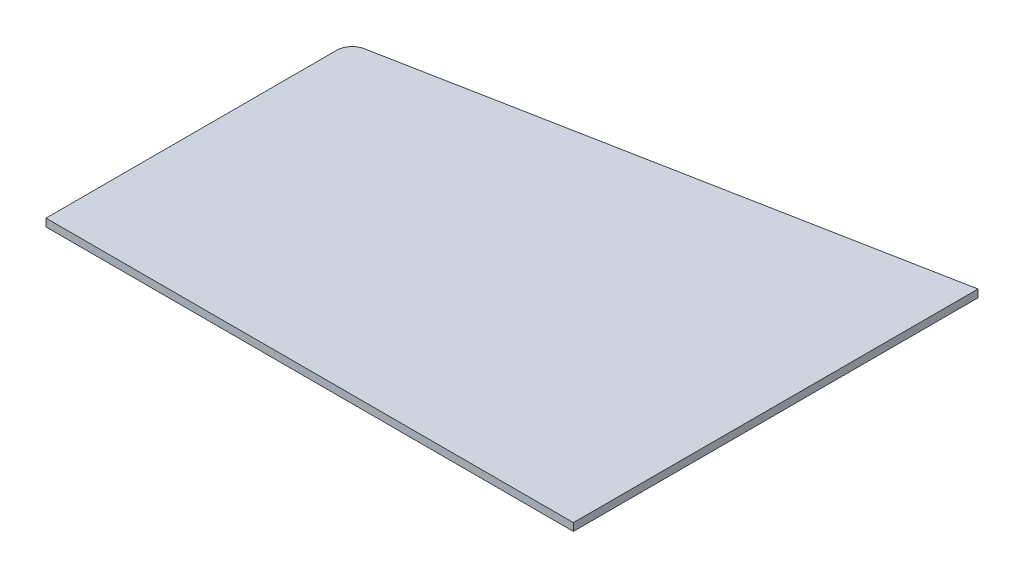
ISO-10303-21;
HEADER;
FILE_DESCRIPTION(('STEP AP214'),'2;1');
FILE_NAME('part.step','',(''),(''),'','','');
FILE_SCHEMA(('AUTOMOTIVE_DESIGN { 1 0 10303 214 1 1 1 1 }'));
ENDSEC;
DATA;
#1=APPLICATION_CONTEXT('core data for automotive mechanical design processes');
#2=APPLICATION_PROTOCOL_DEFINITION('international standard','automotive_design',2000,#1);
#3=PRODUCT_CONTEXT('',#1,'mechanical');
#4=PRODUCT('Part','Part','',(#3));
#5=PRODUCT_RELATED_PRODUCT_CATEGORY('part','',(#4));
#6=PRODUCT_DEFINITION_FORMATION('','',#4);
#7=PRODUCT_DEFINITION_CONTEXT('part definition',#1,'design');
#8=PRODUCT_DEFINITION('design','',#6,#7);
#9=PRODUCT_DEFINITION_SHAPE('','',#8);
#10=(LENGTH_UNIT() NAMED_UNIT(*) SI_UNIT(.MILLI.,.METRE.));
#11=(NAMED_UNIT(*) PLANE_ANGLE_UNIT() SI_UNIT($,.RADIAN.));
#12=(NAMED_UNIT(*) SI_UNIT($,.STERADIAN.) SOLID_ANGLE_UNIT());
#13=UNCERTAINTY_MEASURE_WITH_UNIT(LENGTH_MEASURE(1.E-05),#10,'distance_accuracy_value','');
#14=(GEOMETRIC_REPRESENTATION_CONTEXT(3) GLOBAL_UNCERTAINTY_ASSIGNED_CONTEXT((#13)) GLOBAL_UNIT_ASSIGNED_CONTEXT((#10,
#11,#12)) REPRESENTATION_CONTEXT('',''));
#15=CARTESIAN_POINT('',(0.,0.,0.));
#16=DIRECTION('',(0.,0.,1.));
#17=DIRECTION('',(1.,0.,0.));
#18=AXIS2_PLACEMENT_3D('',#15,#16,#17);
#19=CARTESIAN_POINT('',(0.,6.35,-240.964350343859));
#20=DIRECTION('',(1.,0.,0.));
#21=DIRECTION('',(0.,0.,-1.));
#22=AXIS2_PLACEMENT_3D('',#19,#20,#21);
#23=PLANE('',#22);
#24=DIRECTION('',(0.,0.,1.));
#25=VECTOR('',#24,1.);
#26=CARTESIAN_POINT('',(0.,0.,-240.964350343859));
#27=LINE('',#26,#25);
#28=CARTESIAN_POINT('',(0.,0.,-240.964350343859));
#29=VERTEX_POINT('',#28);
#30=CARTESIAN_POINT('',(0.,0.,0.));
#31=VERTEX_POINT('',#30);
#32=EDGE_CURVE('E118',#29,#31,#27,.T.);
#33=ORIENTED_EDGE('',*,*,#32,.T.);
#34=DIRECTION('',(0.,-1.,0.));
#35=VECTOR('',#34,1.);
#36=CARTESIAN_POINT('',(0.,6.35,0.));
#37=LINE('',#36,#35);
#38=CARTESIAN_POINT('',(0.,6.35,0.));
#39=VERTEX_POINT('',#38);
#40=EDGE_CURVE('E11',#39,#31,#37,.T.);
#41=ORIENTED_EDGE('',*,*,#40,.F.);
#42=DIRECTION('',(0.,0.,1.));
#43=VECTOR('',#42,1.);
#44=CARTESIAN_POINT('',(0.,6.35,-240.964350343859));
#45=LINE('',#44,#43);
#46=CARTESIAN_POINT('',(0.,6.35,-240.964350343859));
#47=VERTEX_POINT('',#46);
#48=EDGE_CURVE('E131',#47,#39,#45,.T.);
#49=ORIENTED_EDGE('',*,*,#48,.F.);
#50=DIRECTION('',(0.,-1.,0.));
#51=VECTOR('',#50,1.);
#52=CARTESIAN_POINT('',(0.,6.35,-240.964350343859));
#53=LINE('',#52,#51);
#54=EDGE_CURVE('E114',#47,#29,#53,.T.);
#55=ORIENTED_EDGE('',*,*,#54,.T.);
#56=EDGE_LOOP('',(#33,#41,#49,#55));
#57=FACE_BOUND('',#56,.T.);
#58=ADVANCED_FACE('F39',(#57),#23,.F.);
#59=CARTESIAN_POINT('',(0.,6.35,0.));
#60=DIRECTION('',(0.,0.,-1.));
#61=DIRECTION('',(-1.,0.,0.));
#62=AXIS2_PLACEMENT_3D('',#59,#60,#61);
#63=PLANE('',#62);
#64=DIRECTION('',(1.,0.,0.));
#65=VECTOR('',#64,1.);
#66=CARTESIAN_POINT('',(0.,0.,0.));
#67=LINE('',#66,#65);
#68=CARTESIAN_POINT('',(437.02224,0.,0.));
#69=VERTEX_POINT('',#68);
#70=EDGE_CURVE('E122',#31,#69,#67,.T.);
#71=ORIENTED_EDGE('',*,*,#70,.T.);
#72=DIRECTION('',(0.,-1.,0.));
#73=VECTOR('',#72,1.);
#74=CARTESIAN_POINT('',(437.02224,6.35,0.));
#75=LINE('',#74,#73);
#76=CARTESIAN_POINT('',(437.02224,6.35,0.));
#77=VERTEX_POINT('',#76);
#78=EDGE_CURVE('E48',#77,#69,#75,.T.);
#79=ORIENTED_EDGE('',*,*,#78,.F.);
#80=DIRECTION('',(1.,0.,0.));
#81=VECTOR('',#80,1.);
#82=CARTESIAN_POINT('',(0.,6.35,0.));
#83=LINE('',#82,#81);
#84=EDGE_CURVE('E90',#39,#77,#83,.T.);
#85=ORIENTED_EDGE('',*,*,#84,.F.);
#86=ORIENTED_EDGE('',*,*,#40,.T.);
#87=EDGE_LOOP('',(#71,#79,#85,#86));
#88=FACE_BOUND('',#87,.T.);
#89=ADVANCED_FACE('F153',(#88),#63,.F.);
#90=CARTESIAN_POINT('',(437.02224,6.35,0.));
#91=DIRECTION('',(-1.,0.,0.));
#92=DIRECTION('',(0.,0.,1.));
#93=AXIS2_PLACEMENT_3D('',#90,#91,#92);
#94=PLANE('',#93);
#95=DIRECTION('',(0.,0.,-1.));
#96=VECTOR('',#95,1.);
#97=CARTESIAN_POINT('',(437.02224,0.,0.));
#98=LINE('',#97,#96);
#99=CARTESIAN_POINT('',(437.02224,0.,-335.28));
#100=VERTEX_POINT('',#99);
#101=EDGE_CURVE('E106',#69,#100,#98,.T.);
#102=ORIENTED_EDGE('',*,*,#101,.T.);
#103=DIRECTION('',(0.,-1.,0.));
#104=VECTOR('',#103,1.);
#105=CARTESIAN_POINT('',(437.02224,6.35,-335.28));
#106=LINE('',#105,#104);
#107=CARTESIAN_POINT('',(437.02224,6.35,-335.28));
#108=VERTEX_POINT('',#107);
#109=EDGE_CURVE('E103',#108,#100,#106,.T.);
#110=ORIENTED_EDGE('',*,*,#109,.F.);
#111=DIRECTION('',(0.,0.,-1.));
#112=VECTOR('',#111,1.);
#113=CARTESIAN_POINT('',(437.02224,6.35,0.));
#114=LINE('',#113,#112);
#115=EDGE_CURVE('E94',#77,#108,#114,.T.);
#116=ORIENTED_EDGE('',*,*,#115,.F.);
#117=ORIENTED_EDGE('',*,*,#78,.T.);
#118=EDGE_LOOP('',(#102,#110,#116,#117));
#119=FACE_BOUND('',#118,.T.);
#120=ADVANCED_FACE('F104',(#119),#94,.F.);
#121=CARTESIAN_POINT('',(437.02224,6.35,-335.28));
#122=DIRECTION('',(0.188364672621634,0.,0.982099154926907));
#123=DIRECTION('',(0.982099154926907,0.,-0.188364672621634));
#124=AXIS2_PLACEMENT_3D('',#121,#122,#123);
#125=PLANE('',#124);
#126=DIRECTION('',(-0.982099154926907,0.,0.188364672621634));
#127=VECTOR('',#126,1.);
#128=CARTESIAN_POINT('',(437.02224,0.,-335.28));
#129=LINE('',#128,#127);
#130=CARTESIAN_POINT('',(10.3077686577053,0.,-253.43700961143));
#131=VERTEX_POINT('',#130);
#132=EDGE_CURVE('E76',#100,#131,#129,.T.);
#133=ORIENTED_EDGE('',*,*,#132,.T.);
#134=DIRECTION('',(0.,-1.,0.));
#135=VECTOR('',#134,1.);
#136=CARTESIAN_POINT('',(10.3077686577053,6.35,-253.43700961143));
#137=LINE('',#136,#135);
#138=CARTESIAN_POINT('',(10.3077686577053,6.35,-253.43700961143));
#139=VERTEX_POINT('',#138);
#140=EDGE_CURVE('E108',#139,#131,#137,.T.);
#141=ORIENTED_EDGE('',*,*,#140,.F.);
#142=DIRECTION('',(-0.982099154926907,0.,0.188364672621634));
#143=VECTOR('',#142,1.);
#144=CARTESIAN_POINT('',(437.02224,6.35,-335.28));
#145=LINE('',#144,#143);
#146=EDGE_CURVE('E98',#108,#139,#145,.T.);
#147=ORIENTED_EDGE('',*,*,#146,.F.);
#148=ORIENTED_EDGE('',*,*,#109,.T.);
#149=EDGE_LOOP('',(#133,#141,#147,#148));
#150=FACE_BOUND('',#149,.T.);
#151=ADVANCED_FACE('F110',(#150),#125,.F.);
#152=CARTESIAN_POINT('',(12.7,6.35,-240.964350343859));
#153=DIRECTION('',(0.,-1.,0.));
#154=DIRECTION('',(0.,0.,-1.));
#155=AXIS2_PLACEMENT_3D('',#152,#153,#154);
#156=CYLINDRICAL_SURFACE('',#155,12.7);
#157=CARTESIAN_POINT('',(12.7,0.,-240.964350343859));
#158=DIRECTION('',(0.,1.,0.));
#159=DIRECTION('',(0.,0.,1.));
#160=AXIS2_PLACEMENT_3D('',#157,#158,#159);
#161=CIRCLE('',#160,12.7);
#162=EDGE_CURVE('E82',#131,#29,#161,.T.);
#163=ORIENTED_EDGE('',*,*,#162,.T.);
#164=ORIENTED_EDGE('',*,*,#54,.F.);
#165=CARTESIAN_POINT('',(12.7,6.35,-240.964350343859));
#166=DIRECTION('',(0.,1.,0.));
#167=DIRECTION('',(0.,0.,1.));
#168=AXIS2_PLACEMENT_3D('',#165,#166,#167);
#169=CIRCLE('',#168,12.7);
#170=EDGE_CURVE('E56',#139,#47,#169,.T.);
#171=ORIENTED_EDGE('',*,*,#170,.F.);
#172=ORIENTED_EDGE('',*,*,#140,.T.);
#173=EDGE_LOOP('',(#163,#164,#171,#172));
#174=FACE_BOUND('',#173,.T.);
#175=ADVANCED_FACE('F142',(#174),#156,.T.);
#176=CARTESIAN_POINT('',(12.7,6.35,-240.964350343859));
#177=DIRECTION('',(0.,1.,0.));
#178=DIRECTION('',(0.,0.,1.));
#179=AXIS2_PLACEMENT_3D('',#176,#177,#178);
#180=PLANE('',#179);
#181=ORIENTED_EDGE('',*,*,#48,.T.);
#182=ORIENTED_EDGE('',*,*,#84,.T.);
#183=ORIENTED_EDGE('',*,*,#115,.T.);
#184=ORIENTED_EDGE('',*,*,#146,.T.);
#185=ORIENTED_EDGE('',*,*,#170,.T.);
#186=EDGE_LOOP('',(#181,#182,#183,#184,#185));
#187=FACE_BOUND('',#186,.T.);
#188=ADVANCED_FACE('F96',(#187),#180,.T.);
#189=CARTESIAN_POINT('',(12.7,0.,-240.964350343859));
#190=DIRECTION('',(0.,1.,0.));
#191=DIRECTION('',(0.,0.,1.));
#192=AXIS2_PLACEMENT_3D('',#189,#190,#191);
#193=PLANE('',#192);
#194=ORIENTED_EDGE('',*,*,#32,.F.);
#195=ORIENTED_EDGE('',*,*,#162,.F.);
#196=ORIENTED_EDGE('',*,*,#132,.F.);
#197=ORIENTED_EDGE('',*,*,#101,.F.);
#198=ORIENTED_EDGE('',*,*,#70,.F.);
#199=EDGE_LOOP('',(#194,#195,#196,#197,#198));
#200=FACE_BOUND('',#199,.T.);
#201=ADVANCED_FACE('F138',(#200),#193,.F.);
#202=CLOSED_SHELL('',(#58,#89,#120,#151,#175,#188,#201));
#203=MANIFOLD_SOLID_BREP('B2',#202);
#204=ADVANCED_BREP_SHAPE_REPRESENTATION('',(#18,#203),#14);
#205=SHAPE_DEFINITION_REPRESENTATION(#9,#204);
ENDSEC;
END-ISO-10303-21;
